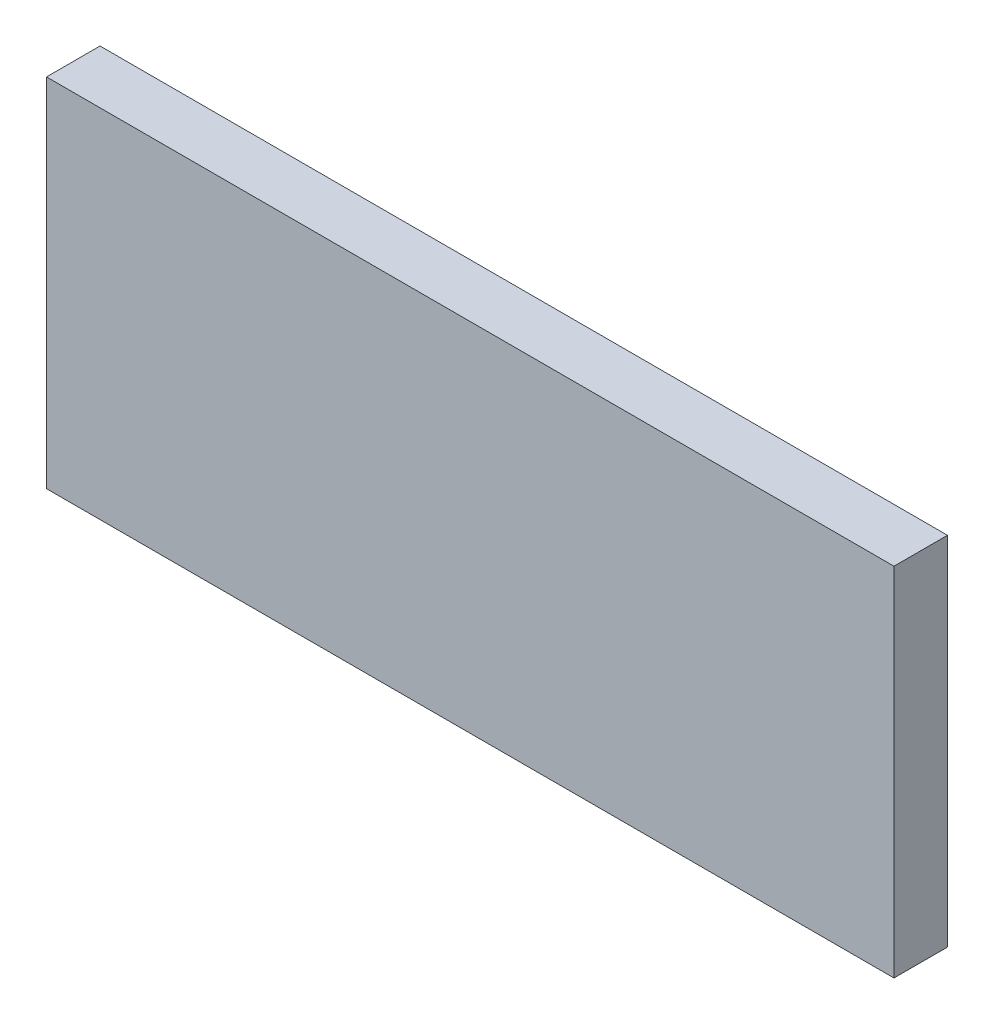
ISO-10303-21;
HEADER;
FILE_DESCRIPTION(('STEP AP214'),'2;1');
FILE_NAME('part.step','',(''),(''),'','','');
FILE_SCHEMA(('AUTOMOTIVE_DESIGN { 1 0 10303 214 1 1 1 1 }'));
ENDSEC;
DATA;
#1=APPLICATION_CONTEXT('core data for automotive mechanical design processes');
#2=APPLICATION_PROTOCOL_DEFINITION('international standard','automotive_design',2000,#1);
#3=PRODUCT_CONTEXT('',#1,'mechanical');
#4=PRODUCT('Part','Part','',(#3));
#5=PRODUCT_RELATED_PRODUCT_CATEGORY('part','',(#4));
#6=PRODUCT_DEFINITION_FORMATION('','',#4);
#7=PRODUCT_DEFINITION_CONTEXT('part definition',#1,'design');
#8=PRODUCT_DEFINITION('design','',#6,#7);
#9=PRODUCT_DEFINITION_SHAPE('','',#8);
#10=(LENGTH_UNIT() NAMED_UNIT(*) SI_UNIT(.MILLI.,.METRE.));
#11=(NAMED_UNIT(*) PLANE_ANGLE_UNIT() SI_UNIT($,.RADIAN.));
#12=(NAMED_UNIT(*) SI_UNIT($,.STERADIAN.) SOLID_ANGLE_UNIT());
#13=UNCERTAINTY_MEASURE_WITH_UNIT(LENGTH_MEASURE(1.E-05),#10,'distance_accuracy_value','');
#14=(GEOMETRIC_REPRESENTATION_CONTEXT(3) GLOBAL_UNCERTAINTY_ASSIGNED_CONTEXT((#13)) GLOBAL_UNIT_ASSIGNED_CONTEXT((#10,
#11,#12)) REPRESENTATION_CONTEXT('',''));
#15=CARTESIAN_POINT('',(0.,0.,0.));
#16=DIRECTION('',(0.,0.,1.));
#17=DIRECTION('',(1.,0.,0.));
#18=AXIS2_PLACEMENT_3D('',#15,#16,#17);
#19=CARTESIAN_POINT('',(71.7706423842376,33.4815197725511,10.));
#20=DIRECTION('',(-1.,0.,0.));
#21=DIRECTION('',(0.,0.,1.));
#22=AXIS2_PLACEMENT_3D('',#19,#20,#21);
#23=PLANE('',#22);
#24=DIRECTION('',(0.,1.,0.));
#25=VECTOR('',#24,1.);
#26=CARTESIAN_POINT('',(71.7706423842376,33.4815197725511,0.));
#27=LINE('',#26,#25);
#28=CARTESIAN_POINT('',(71.7706423842376,-33.1381195697557,0.));
#29=VERTEX_POINT('',#28);
#30=CARTESIAN_POINT('',(71.7706423842376,33.4815197725511,0.));
#31=VERTEX_POINT('',#30);
#32=EDGE_CURVE('E96',#29,#31,#27,.T.);
#33=ORIENTED_EDGE('',*,*,#32,.T.);
#34=DIRECTION('',(0.,0.,-1.));
#35=VECTOR('',#34,1.);
#36=CARTESIAN_POINT('',(71.7706423842376,33.4815197725511,10.));
#37=LINE('',#36,#35);
#38=CARTESIAN_POINT('',(71.7706423842376,33.4815197725511,10.));
#39=VERTEX_POINT('',#38);
#40=EDGE_CURVE('E11',#39,#31,#37,.T.);
#41=ORIENTED_EDGE('',*,*,#40,.F.);
#42=DIRECTION('',(0.,1.,0.));
#43=VECTOR('',#42,1.);
#44=CARTESIAN_POINT('',(71.7706423842376,33.4815197725511,10.));
#45=LINE('',#44,#43);
#46=CARTESIAN_POINT('',(71.7706423842376,-33.1381195697557,10.));
#47=VERTEX_POINT('',#46);
#48=EDGE_CURVE('E84',#47,#39,#45,.T.);
#49=ORIENTED_EDGE('',*,*,#48,.F.);
#50=DIRECTION('',(0.,0.,-1.));
#51=VECTOR('',#50,1.);
#52=CARTESIAN_POINT('',(71.7706423842376,-33.1381195697557,10.));
#53=LINE('',#52,#51);
#54=EDGE_CURVE('E92',#47,#29,#53,.T.);
#55=ORIENTED_EDGE('',*,*,#54,.T.);
#56=EDGE_LOOP('',(#33,#41,#49,#55));
#57=FACE_BOUND('',#56,.T.);
#58=ADVANCED_FACE('F33',(#57),#23,.F.);
#59=CARTESIAN_POINT('',(71.7706423842376,33.4815197725511,10.));
#60=DIRECTION('',(0.,-1.,0.));
#61=DIRECTION('',(0.,0.,-1.));
#62=AXIS2_PLACEMENT_3D('',#59,#60,#61);
#63=PLANE('',#62);
#64=DIRECTION('',(-1.,0.,0.));
#65=VECTOR('',#64,1.);
#66=CARTESIAN_POINT('',(71.7706423842376,33.4815197725511,0.));
#67=LINE('',#66,#65);
#68=CARTESIAN_POINT('',(-86.5368511044396,33.4815197725511,0.));
#69=VERTEX_POINT('',#68);
#70=EDGE_CURVE('E88',#31,#69,#67,.T.);
#71=ORIENTED_EDGE('',*,*,#70,.T.);
#72=DIRECTION('',(0.,0.,-1.));
#73=VECTOR('',#72,1.);
#74=CARTESIAN_POINT('',(-86.5368511044396,33.4815197725511,10.));
#75=LINE('',#74,#73);
#76=CARTESIAN_POINT('',(-86.5368511044396,33.4815197725511,10.));
#77=VERTEX_POINT('',#76);
#78=EDGE_CURVE('E41',#77,#69,#75,.T.);
#79=ORIENTED_EDGE('',*,*,#78,.F.);
#80=DIRECTION('',(-1.,0.,0.));
#81=VECTOR('',#80,1.);
#82=CARTESIAN_POINT('',(71.7706423842376,33.4815197725511,10.));
#83=LINE('',#82,#81);
#84=EDGE_CURVE('E79',#39,#77,#83,.T.);
#85=ORIENTED_EDGE('',*,*,#84,.F.);
#86=ORIENTED_EDGE('',*,*,#40,.T.);
#87=EDGE_LOOP('',(#71,#79,#85,#86));
#88=FACE_BOUND('',#87,.T.);
#89=ADVANCED_FACE('F87',(#88),#63,.F.);
#90=CARTESIAN_POINT('',(-86.5368511044396,33.4815197725511,10.));
#91=DIRECTION('',(1.,0.,0.));
#92=DIRECTION('',(0.,0.,-1.));
#93=AXIS2_PLACEMENT_3D('',#90,#91,#92);
#94=PLANE('',#93);
#95=DIRECTION('',(0.,-1.,0.));
#96=VECTOR('',#95,1.);
#97=CARTESIAN_POINT('',(-86.5368511044396,33.4815197725511,0.));
#98=LINE('',#97,#96);
#99=CARTESIAN_POINT('',(-86.5368511044396,-33.1381195697557,0.));
#100=VERTEX_POINT('',#99);
#101=EDGE_CURVE('E66',#69,#100,#98,.T.);
#102=ORIENTED_EDGE('',*,*,#101,.T.);
#103=DIRECTION('',(0.,0.,-1.));
#104=VECTOR('',#103,1.);
#105=CARTESIAN_POINT('',(-86.5368511044396,-33.1381195697557,10.));
#106=LINE('',#105,#104);
#107=CARTESIAN_POINT('',(-86.5368511044396,-33.1381195697557,10.));
#108=VERTEX_POINT('',#107);
#109=EDGE_CURVE('E89',#108,#100,#106,.T.);
#110=ORIENTED_EDGE('',*,*,#109,.F.);
#111=DIRECTION('',(0.,-1.,0.));
#112=VECTOR('',#111,1.);
#113=CARTESIAN_POINT('',(-86.5368511044396,33.4815197725511,10.));
#114=LINE('',#113,#112);
#115=EDGE_CURVE('E82',#77,#108,#114,.T.);
#116=ORIENTED_EDGE('',*,*,#115,.F.);
#117=ORIENTED_EDGE('',*,*,#78,.T.);
#118=EDGE_LOOP('',(#102,#110,#116,#117));
#119=FACE_BOUND('',#118,.T.);
#120=ADVANCED_FACE('F90',(#119),#94,.F.);
#121=CARTESIAN_POINT('',(71.7706423842376,-33.1381195697557,10.));
#122=DIRECTION('',(0.,1.,0.));
#123=DIRECTION('',(0.,0.,1.));
#124=AXIS2_PLACEMENT_3D('',#121,#122,#123);
#125=PLANE('',#124);
#126=DIRECTION('',(1.,0.,0.));
#127=VECTOR('',#126,1.);
#128=CARTESIAN_POINT('',(71.7706423842376,-33.1381195697557,0.));
#129=LINE('',#128,#127);
#130=EDGE_CURVE('E72',#100,#29,#129,.T.);
#131=ORIENTED_EDGE('',*,*,#130,.T.);
#132=ORIENTED_EDGE('',*,*,#54,.F.);
#133=DIRECTION('',(1.,0.,0.));
#134=VECTOR('',#133,1.);
#135=CARTESIAN_POINT('',(71.7706423842376,-33.1381195697557,10.));
#136=LINE('',#135,#134);
#137=EDGE_CURVE('E49',#108,#47,#136,.T.);
#138=ORIENTED_EDGE('',*,*,#137,.F.);
#139=ORIENTED_EDGE('',*,*,#109,.T.);
#140=EDGE_LOOP('',(#131,#132,#138,#139));
#141=FACE_BOUND('',#140,.T.);
#142=ADVANCED_FACE('F103',(#141),#125,.F.);
#143=CARTESIAN_POINT('',(0.,0.,10.));
#144=DIRECTION('',(0.,0.,-1.));
#145=DIRECTION('',(-1.,0.,0.));
#146=AXIS2_PLACEMENT_3D('',#143,#144,#145);
#147=PLANE('',#146);
#148=ORIENTED_EDGE('',*,*,#48,.T.);
#149=ORIENTED_EDGE('',*,*,#84,.T.);
#150=ORIENTED_EDGE('',*,*,#115,.T.);
#151=ORIENTED_EDGE('',*,*,#137,.T.);
#152=EDGE_LOOP('',(#148,#149,#150,#151));
#153=FACE_BOUND('',#152,.T.);
#154=ADVANCED_FACE('F80',(#153),#147,.F.);
#155=CARTESIAN_POINT('',(0.,0.,0.));
#156=DIRECTION('',(0.,0.,-1.));
#157=DIRECTION('',(-1.,0.,0.));
#158=AXIS2_PLACEMENT_3D('',#155,#156,#157);
#159=PLANE('',#158);
#160=ORIENTED_EDGE('',*,*,#32,.F.);
#161=ORIENTED_EDGE('',*,*,#130,.F.);
#162=ORIENTED_EDGE('',*,*,#101,.F.);
#163=ORIENTED_EDGE('',*,*,#70,.F.);
#164=EDGE_LOOP('',(#160,#161,#162,#163));
#165=FACE_BOUND('',#164,.T.);
#166=ADVANCED_FACE('F106',(#165),#159,.T.);
#167=CLOSED_SHELL('',(#58,#89,#120,#142,#154,#166));
#168=MANIFOLD_SOLID_BREP('B2',#167);
#169=ADVANCED_BREP_SHAPE_REPRESENTATION('',(#18,#168),#14);
#170=SHAPE_DEFINITION_REPRESENTATION(#9,#169);
ENDSEC;
END-ISO-10303-21;
